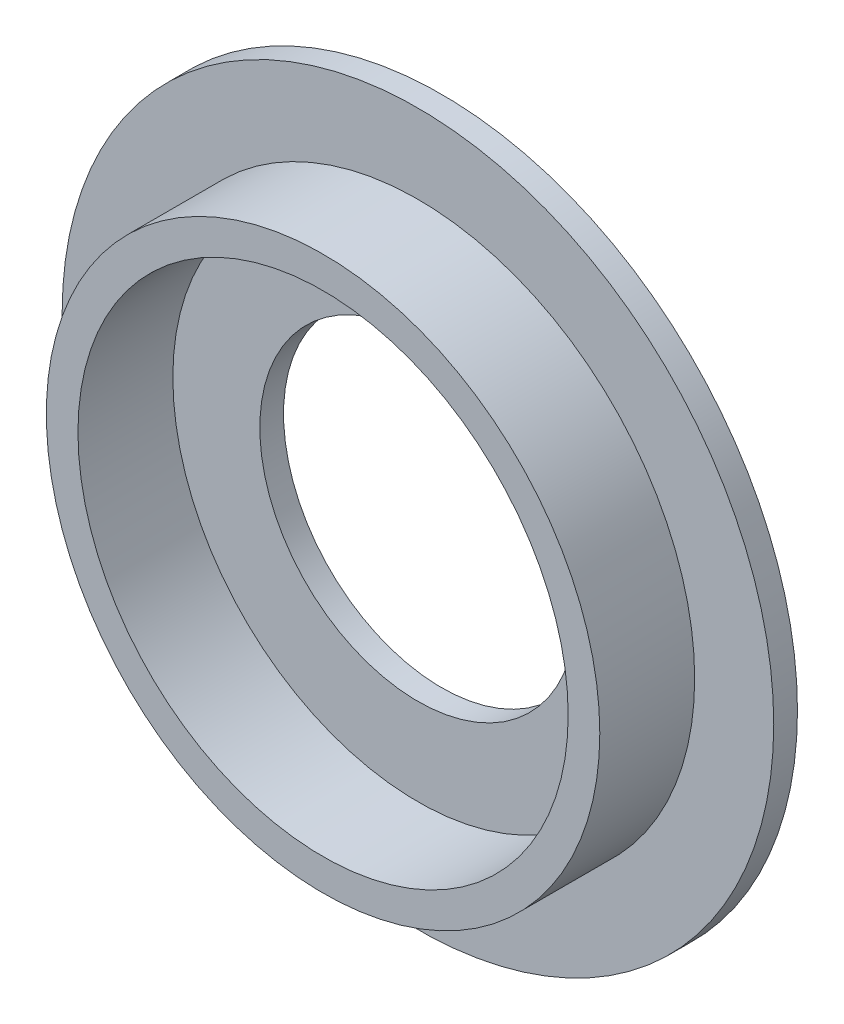
ISO-10303-21;
HEADER;
FILE_DESCRIPTION(('STEP AP214'),'2;1');
FILE_NAME('part.step','',(''),(''),'','','');
FILE_SCHEMA(('AUTOMOTIVE_DESIGN { 1 0 10303 214 1 1 1 1 }'));
ENDSEC;
DATA;
#1=APPLICATION_CONTEXT('core data for automotive mechanical design processes');
#2=APPLICATION_PROTOCOL_DEFINITION('international standard','automotive_design',2000,#1);
#3=PRODUCT_CONTEXT('',#1,'mechanical');
#4=PRODUCT('Part','Part','',(#3));
#5=PRODUCT_RELATED_PRODUCT_CATEGORY('part','',(#4));
#6=PRODUCT_DEFINITION_FORMATION('','',#4);
#7=PRODUCT_DEFINITION_CONTEXT('part definition',#1,'design');
#8=PRODUCT_DEFINITION('design','',#6,#7);
#9=PRODUCT_DEFINITION_SHAPE('','',#8);
#10=(LENGTH_UNIT() NAMED_UNIT(*) SI_UNIT(.MILLI.,.METRE.));
#11=(NAMED_UNIT(*) PLANE_ANGLE_UNIT() SI_UNIT($,.RADIAN.));
#12=(NAMED_UNIT(*) SI_UNIT($,.STERADIAN.) SOLID_ANGLE_UNIT());
#13=UNCERTAINTY_MEASURE_WITH_UNIT(LENGTH_MEASURE(1.E-05),#10,'distance_accuracy_value','');
#14=(GEOMETRIC_REPRESENTATION_CONTEXT(3) GLOBAL_UNCERTAINTY_ASSIGNED_CONTEXT((#13)) GLOBAL_UNIT_ASSIGNED_CONTEXT((#10,
#11,#12)) REPRESENTATION_CONTEXT('',''));
#15=CARTESIAN_POINT('',(0.,0.,0.));
#16=DIRECTION('',(0.,0.,1.));
#17=DIRECTION('',(1.,0.,0.));
#18=AXIS2_PLACEMENT_3D('',#15,#16,#17);
#19=CARTESIAN_POINT('',(0.,0.,3.));
#20=DIRECTION('',(0.,0.,-1.));
#21=DIRECTION('',(-1.,0.,0.));
#22=AXIS2_PLACEMENT_3D('',#19,#20,#21);
#23=CYLINDRICAL_SURFACE('',#22,45.);
#24=CARTESIAN_POINT('',(0.,0.,3.));
#25=DIRECTION('',(0.,0.,1.));
#26=DIRECTION('',(1.,0.,0.));
#27=AXIS2_PLACEMENT_3D('',#24,#25,#26);
#28=CIRCLE('',#27,45.);
#29=CARTESIAN_POINT('',(45.,0.,3.));
#30=VERTEX_POINT('',#29);
#31=EDGE_CURVE('E48',#30,#30,#28,.T.);
#32=ORIENTED_EDGE('',*,*,#31,.F.);
#33=EDGE_LOOP('',(#32));
#34=FACE_BOUND('',#33,.T.);
#35=CARTESIAN_POINT('',(0.,0.,0.));
#36=DIRECTION('',(0.,0.,1.));
#37=DIRECTION('',(1.,0.,0.));
#38=AXIS2_PLACEMENT_3D('',#35,#36,#37);
#39=CIRCLE('',#38,45.);
#40=CARTESIAN_POINT('',(45.,0.,0.));
#41=VERTEX_POINT('',#40);
#42=EDGE_CURVE('E53',#41,#41,#39,.T.);
#43=ORIENTED_EDGE('',*,*,#42,.T.);
#44=EDGE_LOOP('',(#43));
#45=FACE_BOUND('',#44,.T.);
#46=ADVANCED_FACE('F41',(#34,#45),#23,.T.);
#47=CARTESIAN_POINT('',(0.,0.,3.));
#48=DIRECTION('',(0.,0.,1.));
#49=DIRECTION('',(1.,0.,0.));
#50=AXIS2_PLACEMENT_3D('',#47,#48,#49);
#51=PLANE('',#50);
#52=CARTESIAN_POINT('',(0.,0.,3.));
#53=DIRECTION('',(0.,0.,1.));
#54=DIRECTION('',(1.,0.,0.));
#55=AXIS2_PLACEMENT_3D('',#52,#53,#54);
#56=CIRCLE('',#55,35.);
#57=CARTESIAN_POINT('',(35.,0.,3.));
#58=VERTEX_POINT('',#57);
#59=EDGE_CURVE('E10',#58,#58,#56,.T.);
#60=ORIENTED_EDGE('',*,*,#59,.F.);
#61=EDGE_LOOP('',(#60));
#62=FACE_BOUND('',#61,.T.);
#63=ORIENTED_EDGE('',*,*,#31,.T.);
#64=EDGE_LOOP('',(#63));
#65=FACE_BOUND('',#64,.T.);
#66=ADVANCED_FACE('F93',(#62,#65),#51,.T.);
#67=CARTESIAN_POINT('',(0.,0.,0.));
#68=DIRECTION('',(0.,0.,1.));
#69=DIRECTION('',(1.,0.,0.));
#70=AXIS2_PLACEMENT_3D('',#67,#68,#69);
#71=PLANE('',#70);
#72=CARTESIAN_POINT('',(0.,0.,0.));
#73=DIRECTION('',(0.,0.,1.));
#74=DIRECTION('',(1.,0.,0.));
#75=AXIS2_PLACEMENT_3D('',#72,#73,#74);
#76=CIRCLE('',#75,20.);
#77=CARTESIAN_POINT('',(20.,0.,0.));
#78=VERTEX_POINT('',#77);
#79=EDGE_CURVE('E44',#78,#78,#76,.T.);
#80=ORIENTED_EDGE('',*,*,#79,.T.);
#81=EDGE_LOOP('',(#80));
#82=FACE_BOUND('',#81,.T.);
#83=ORIENTED_EDGE('',*,*,#42,.F.);
#84=EDGE_LOOP('',(#83));
#85=FACE_BOUND('',#84,.T.);
#86=ADVANCED_FACE('F79',(#82,#85),#71,.F.);
#87=CARTESIAN_POINT('',(0.,0.,15.));
#88=DIRECTION('',(0.,0.,-1.));
#89=DIRECTION('',(-1.,0.,0.));
#90=AXIS2_PLACEMENT_3D('',#87,#88,#89);
#91=CYLINDRICAL_SURFACE('',#90,35.);
#92=CARTESIAN_POINT('',(0.,0.,15.));
#93=DIRECTION('',(0.,0.,1.));
#94=DIRECTION('',(1.,0.,0.));
#95=AXIS2_PLACEMENT_3D('',#92,#93,#94);
#96=CIRCLE('',#95,35.);
#97=CARTESIAN_POINT('',(35.,0.,15.));
#98=VERTEX_POINT('',#97);
#99=EDGE_CURVE('E56',#98,#98,#96,.T.);
#100=ORIENTED_EDGE('',*,*,#99,.F.);
#101=EDGE_LOOP('',(#100));
#102=FACE_BOUND('',#101,.T.);
#103=ORIENTED_EDGE('',*,*,#59,.T.);
#104=EDGE_LOOP('',(#103));
#105=FACE_BOUND('',#104,.T.);
#106=ADVANCED_FACE('F106',(#102,#105),#91,.T.);
#107=CARTESIAN_POINT('',(0.,0.,15.));
#108=DIRECTION('',(0.,0.,1.));
#109=DIRECTION('',(1.,0.,0.));
#110=AXIS2_PLACEMENT_3D('',#107,#108,#109);
#111=PLANE('',#110);
#112=CARTESIAN_POINT('',(0.,0.,15.));
#113=DIRECTION('',(0.,0.,1.));
#114=DIRECTION('',(1.,0.,0.));
#115=AXIS2_PLACEMENT_3D('',#112,#113,#114);
#116=CIRCLE('',#115,31.);
#117=CARTESIAN_POINT('',(31.,0.,15.));
#118=VERTEX_POINT('',#117);
#119=EDGE_CURVE('E66',#118,#118,#116,.T.);
#120=ORIENTED_EDGE('',*,*,#119,.F.);
#121=EDGE_LOOP('',(#120));
#122=FACE_BOUND('',#121,.T.);
#123=ORIENTED_EDGE('',*,*,#99,.T.);
#124=EDGE_LOOP('',(#123));
#125=FACE_BOUND('',#124,.T.);
#126=ADVANCED_FACE('F109',(#122,#125),#111,.T.);
#127=CARTESIAN_POINT('',(0.,0.,3.));
#128=DIRECTION('',(0.,0.,1.));
#129=DIRECTION('',(1.,0.,0.));
#130=AXIS2_PLACEMENT_3D('',#127,#128,#129);
#131=CYLINDRICAL_SURFACE('',#130,31.);
#132=CARTESIAN_POINT('',(0.,0.,3.));
#133=DIRECTION('',(0.,0.,1.));
#134=DIRECTION('',(1.,0.,0.));
#135=AXIS2_PLACEMENT_3D('',#132,#133,#134);
#136=CIRCLE('',#135,31.);
#137=CARTESIAN_POINT('',(31.,0.,3.));
#138=VERTEX_POINT('',#137);
#139=EDGE_CURVE('E62',#138,#138,#136,.T.);
#140=ORIENTED_EDGE('',*,*,#139,.F.);
#141=EDGE_LOOP('',(#140));
#142=FACE_BOUND('',#141,.T.);
#143=ORIENTED_EDGE('',*,*,#119,.T.);
#144=EDGE_LOOP('',(#143));
#145=FACE_BOUND('',#144,.T.);
#146=ADVANCED_FACE('F89',(#142,#145),#131,.F.);
#147=CARTESIAN_POINT('',(0.,0.,3.));
#148=DIRECTION('',(0.,0.,1.));
#149=DIRECTION('',(1.,0.,0.));
#150=AXIS2_PLACEMENT_3D('',#147,#148,#149);
#151=PLANE('',#150);
#152=CARTESIAN_POINT('',(0.,0.,3.));
#153=DIRECTION('',(0.,0.,1.));
#154=DIRECTION('',(1.,0.,0.));
#155=AXIS2_PLACEMENT_3D('',#152,#153,#154);
#156=CIRCLE('',#155,20.);
#157=CARTESIAN_POINT('',(20.,0.,3.));
#158=VERTEX_POINT('',#157);
#159=EDGE_CURVE('E72',#158,#158,#156,.T.);
#160=ORIENTED_EDGE('',*,*,#159,.F.);
#161=EDGE_LOOP('',(#160));
#162=FACE_BOUND('',#161,.T.);
#163=ORIENTED_EDGE('',*,*,#139,.T.);
#164=EDGE_LOOP('',(#163));
#165=FACE_BOUND('',#164,.T.);
#166=ADVANCED_FACE('F84',(#162,#165),#151,.T.);
#167=CARTESIAN_POINT('',(0.,0.,-5.));
#168=DIRECTION('',(0.,0.,1.));
#169=DIRECTION('',(1.,0.,0.));
#170=AXIS2_PLACEMENT_3D('',#167,#168,#169);
#171=CYLINDRICAL_SURFACE('',#170,20.);
#172=ORIENTED_EDGE('',*,*,#159,.T.);
#173=EDGE_LOOP('',(#172));
#174=FACE_BOUND('',#173,.T.);
#175=ORIENTED_EDGE('',*,*,#79,.F.);
#176=EDGE_LOOP('',(#175));
#177=FACE_BOUND('',#176,.T.);
#178=ADVANCED_FACE('F82',(#174,#177),#171,.F.);
#179=CLOSED_SHELL('',(#46,#66,#86,#106,#126,#146,#166,#178));
#180=MANIFOLD_SOLID_BREP('B2',#179);
#181=ADVANCED_BREP_SHAPE_REPRESENTATION('',(#18,#180),#14);
#182=SHAPE_DEFINITION_REPRESENTATION(#9,#181);
ENDSEC;
END-ISO-10303-21;
